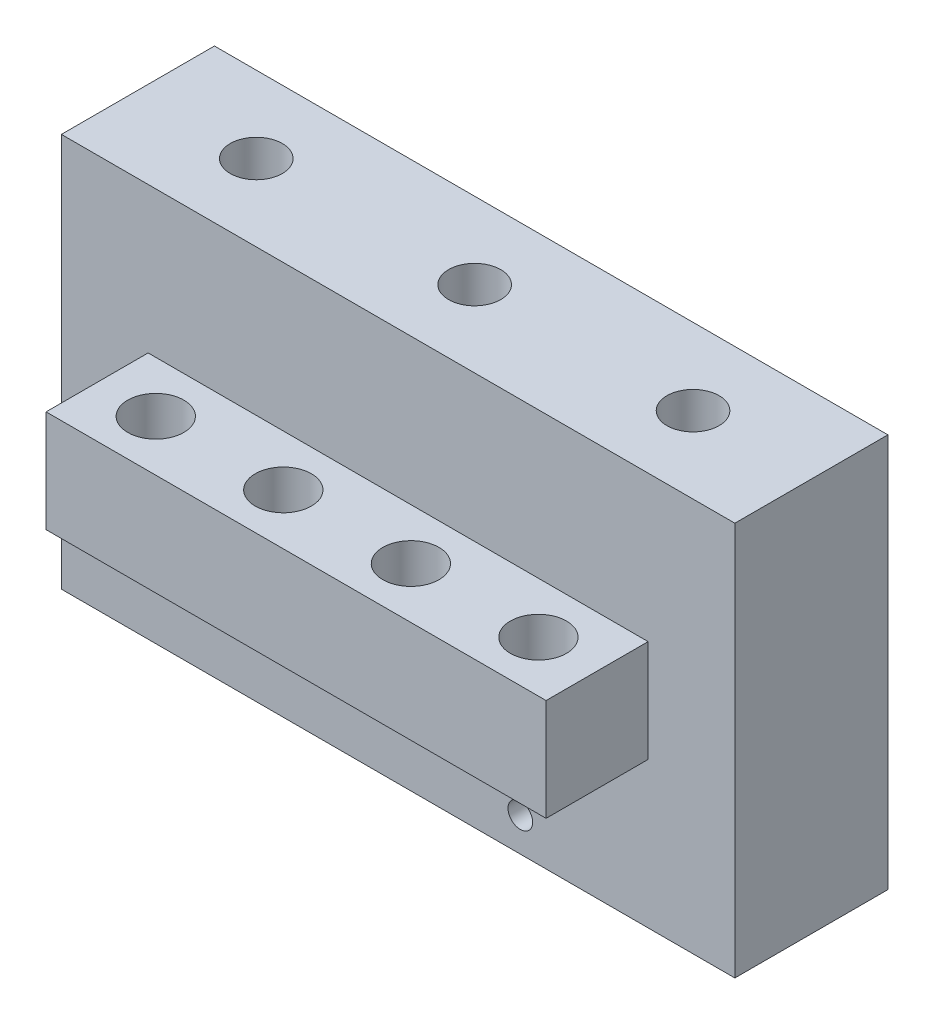
ISO-10303-21;
HEADER;
FILE_DESCRIPTION(('STEP AP214'),'2;1');
FILE_NAME('part.step','',(''),(''),'','','');
FILE_SCHEMA(('AUTOMOTIVE_DESIGN { 1 0 10303 214 1 1 1 1 }'));
ENDSEC;
DATA;
#1=APPLICATION_CONTEXT('core data for automotive mechanical design processes');
#2=APPLICATION_PROTOCOL_DEFINITION('international standard','automotive_design',2000,#1);
#3=PRODUCT_CONTEXT('',#1,'mechanical');
#4=PRODUCT('Part','Part','',(#3));
#5=PRODUCT_RELATED_PRODUCT_CATEGORY('part','',(#4));
#6=PRODUCT_DEFINITION_FORMATION('','',#4);
#7=PRODUCT_DEFINITION_CONTEXT('part definition',#1,'design');
#8=PRODUCT_DEFINITION('design','',#6,#7);
#9=PRODUCT_DEFINITION_SHAPE('','',#8);
#10=(LENGTH_UNIT() NAMED_UNIT(*) SI_UNIT(.MILLI.,.METRE.));
#11=(NAMED_UNIT(*) PLANE_ANGLE_UNIT() SI_UNIT($,.RADIAN.));
#12=(NAMED_UNIT(*) SI_UNIT($,.STERADIAN.) SOLID_ANGLE_UNIT());
#13=UNCERTAINTY_MEASURE_WITH_UNIT(LENGTH_MEASURE(1.E-05),#10,'distance_accuracy_value','');
#14=(GEOMETRIC_REPRESENTATION_CONTEXT(3) GLOBAL_UNCERTAINTY_ASSIGNED_CONTEXT((#13)) GLOBAL_UNIT_ASSIGNED_CONTEXT((#10,
#11,#12)) REPRESENTATION_CONTEXT('',''));
#15=CARTESIAN_POINT('',(0.,0.,0.));
#16=DIRECTION('',(0.,0.,1.));
#17=DIRECTION('',(1.,0.,0.));
#18=AXIS2_PLACEMENT_3D('',#15,#16,#17);
#19=CARTESIAN_POINT('',(24.5,10.,0.));
#20=DIRECTION('',(-1.,0.,0.));
#21=DIRECTION('',(0.,0.,1.));
#22=AXIS2_PLACEMENT_3D('',#19,#20,#21);
#23=PLANE('',#22);
#24=DIRECTION('',(0.,0.,-1.));
#25=VECTOR('',#24,1.);
#26=CARTESIAN_POINT('',(24.5,0.,0.));
#27=LINE('',#26,#25);
#28=CARTESIAN_POINT('',(24.5,0.,0.));
#29=VERTEX_POINT('',#28);
#30=CARTESIAN_POINT('',(24.5,0.,-10.));
#31=VERTEX_POINT('',#30);
#32=EDGE_CURVE('E157',#29,#31,#27,.T.);
#33=ORIENTED_EDGE('',*,*,#32,.T.);
#34=DIRECTION('',(0.,-1.,0.));
#35=VECTOR('',#34,1.);
#36=CARTESIAN_POINT('',(24.5,10.,-10.));
#37=LINE('',#36,#35);
#38=CARTESIAN_POINT('',(24.5,10.,-10.));
#39=VERTEX_POINT('',#38);
#40=EDGE_CURVE('E11',#39,#31,#37,.T.);
#41=ORIENTED_EDGE('',*,*,#40,.F.);
#42=DIRECTION('',(0.,0.,-1.));
#43=VECTOR('',#42,1.);
#44=CARTESIAN_POINT('',(24.5,10.,0.));
#45=LINE('',#44,#43);
#46=CARTESIAN_POINT('',(24.5,10.,0.));
#47=VERTEX_POINT('',#46);
#48=EDGE_CURVE('E76',#47,#39,#45,.T.);
#49=ORIENTED_EDGE('',*,*,#48,.F.);
#50=DIRECTION('',(0.,-1.,0.));
#51=VECTOR('',#50,1.);
#52=CARTESIAN_POINT('',(24.5,10.,0.));
#53=LINE('',#52,#51);
#54=EDGE_CURVE('E53',#47,#29,#53,.T.);
#55=ORIENTED_EDGE('',*,*,#54,.T.);
#56=EDGE_LOOP('',(#33,#41,#49,#55));
#57=FACE_BOUND('',#56,.T.);
#58=ADVANCED_FACE('F36',(#57),#23,.F.);
#59=CARTESIAN_POINT('',(-24.5,10.,0.));
#60=DIRECTION('',(-1.,0.,0.));
#61=DIRECTION('',(0.,0.,1.));
#62=AXIS2_PLACEMENT_3D('',#59,#60,#61);
#63=PLANE('',#62);
#64=DIRECTION('',(0.,0.,-1.));
#65=VECTOR('',#64,1.);
#66=CARTESIAN_POINT('',(-24.5,0.,0.));
#67=LINE('',#66,#65);
#68=CARTESIAN_POINT('',(-24.5,0.,0.));
#69=VERTEX_POINT('',#68);
#70=CARTESIAN_POINT('',(-24.5,0.,-10.));
#71=VERTEX_POINT('',#70);
#72=EDGE_CURVE('E191',#69,#71,#67,.T.);
#73=ORIENTED_EDGE('',*,*,#72,.F.);
#74=DIRECTION('',(0.,-1.,0.));
#75=VECTOR('',#74,1.);
#76=CARTESIAN_POINT('',(-24.5,10.,0.));
#77=LINE('',#76,#75);
#78=CARTESIAN_POINT('',(-24.5,10.,0.));
#79=VERTEX_POINT('',#78);
#80=EDGE_CURVE('E65',#79,#69,#77,.T.);
#81=ORIENTED_EDGE('',*,*,#80,.F.);
#82=DIRECTION('',(0.,0.,-1.));
#83=VECTOR('',#82,1.);
#84=CARTESIAN_POINT('',(-24.5,10.,0.));
#85=LINE('',#84,#83);
#86=CARTESIAN_POINT('',(-24.5,10.,-10.));
#87=VERTEX_POINT('',#86);
#88=EDGE_CURVE('E183',#79,#87,#85,.T.);
#89=ORIENTED_EDGE('',*,*,#88,.T.);
#90=DIRECTION('',(0.,-1.,0.));
#91=VECTOR('',#90,1.);
#92=CARTESIAN_POINT('',(-24.5,10.,-10.));
#93=LINE('',#92,#91);
#94=EDGE_CURVE('E45',#87,#71,#93,.T.);
#95=ORIENTED_EDGE('',*,*,#94,.T.);
#96=EDGE_LOOP('',(#73,#81,#89,#95));
#97=FACE_BOUND('',#96,.T.);
#98=ADVANCED_FACE('F200',(#97),#63,.T.);
#99=CARTESIAN_POINT('',(24.5,10.,0.));
#100=DIRECTION('',(0.,0.,1.));
#101=DIRECTION('',(1.,0.,0.));
#102=AXIS2_PLACEMENT_3D('',#99,#100,#101);
#103=PLANE('',#102);
#104=DIRECTION('',(-1.,0.,0.));
#105=VECTOR('',#104,1.);
#106=CARTESIAN_POINT('',(24.5,0.,0.));
#107=LINE('',#106,#105);
#108=EDGE_CURVE('E180',#29,#69,#107,.T.);
#109=ORIENTED_EDGE('',*,*,#108,.F.);
#110=ORIENTED_EDGE('',*,*,#54,.F.);
#111=DIRECTION('',(-1.,0.,0.));
#112=VECTOR('',#111,1.);
#113=CARTESIAN_POINT('',(24.5,10.,0.));
#114=LINE('',#113,#112);
#115=EDGE_CURVE('E186',#47,#79,#114,.T.);
#116=ORIENTED_EDGE('',*,*,#115,.T.);
#117=ORIENTED_EDGE('',*,*,#80,.T.);
#118=EDGE_LOOP('',(#109,#110,#116,#117));
#119=FACE_BOUND('',#118,.T.);
#120=ADVANCED_FACE('F208',(#119),#103,.T.);
#121=CARTESIAN_POINT('',(0.,10.,0.));
#122=DIRECTION('',(0.,-1.,0.));
#123=DIRECTION('',(0.,0.,-1.));
#124=AXIS2_PLACEMENT_3D('',#121,#122,#123);
#125=PLANE('',#124);
#126=CARTESIAN_POINT('',(-18.75,10.,-5.));
#127=DIRECTION('',(0.,1.,0.));
#128=DIRECTION('',(0.,0.,1.));
#129=AXIS2_PLACEMENT_3D('',#126,#127,#128);
#130=CIRCLE('',#129,2.75);
#131=CARTESIAN_POINT('',(-18.75,10.,-2.25));
#132=VERTEX_POINT('',#131);
#133=EDGE_CURVE('E158',#132,#132,#130,.T.);
#134=ORIENTED_EDGE('',*,*,#133,.F.);
#135=EDGE_LOOP('',(#134));
#136=FACE_BOUND('',#135,.T.);
#137=CARTESIAN_POINT('',(-6.25,10.,-5.));
#138=DIRECTION('',(0.,1.,0.));
#139=DIRECTION('',(0.,0.,1.));
#140=AXIS2_PLACEMENT_3D('',#137,#138,#139);
#141=CIRCLE('',#140,2.75);
#142=CARTESIAN_POINT('',(-6.25,10.,-2.25));
#143=VERTEX_POINT('',#142);
#144=EDGE_CURVE('E164',#143,#143,#141,.T.);
#145=ORIENTED_EDGE('',*,*,#144,.F.);
#146=EDGE_LOOP('',(#145));
#147=FACE_BOUND('',#146,.T.);
#148=CARTESIAN_POINT('',(6.25,10.,-5.));
#149=DIRECTION('',(0.,1.,0.));
#150=DIRECTION('',(0.,0.,1.));
#151=AXIS2_PLACEMENT_3D('',#148,#149,#150);
#152=CIRCLE('',#151,2.75);
#153=CARTESIAN_POINT('',(6.25,10.,-2.25));
#154=VERTEX_POINT('',#153);
#155=EDGE_CURVE('E170',#154,#154,#152,.T.);
#156=ORIENTED_EDGE('',*,*,#155,.F.);
#157=EDGE_LOOP('',(#156));
#158=FACE_BOUND('',#157,.T.);
#159=CARTESIAN_POINT('',(18.75,10.,-5.));
#160=DIRECTION('',(0.,1.,0.));
#161=DIRECTION('',(0.,0.,1.));
#162=AXIS2_PLACEMENT_3D('',#159,#160,#161);
#163=CIRCLE('',#162,2.75);
#164=CARTESIAN_POINT('',(18.75,10.,-2.25));
#165=VERTEX_POINT('',#164);
#166=EDGE_CURVE('E151',#165,#165,#163,.T.);
#167=ORIENTED_EDGE('',*,*,#166,.F.);
#168=EDGE_LOOP('',(#167));
#169=FACE_BOUND('',#168,.T.);
#170=ORIENTED_EDGE('',*,*,#48,.T.);
#171=DIRECTION('',(1.,0.,0.));
#172=VECTOR('',#171,1.);
#173=CARTESIAN_POINT('',(-24.5,10.,-10.));
#174=LINE('',#173,#172);
#175=EDGE_CURVE('E179',#87,#39,#174,.T.);
#176=ORIENTED_EDGE('',*,*,#175,.F.);
#177=ORIENTED_EDGE('',*,*,#88,.F.);
#178=ORIENTED_EDGE('',*,*,#115,.F.);
#179=EDGE_LOOP('',(#170,#176,#177,#178));
#180=FACE_BOUND('',#179,.T.);
#181=ADVANCED_FACE('F210',(#136,#147,#158,#169,#180),#125,.F.);
#182=CARTESIAN_POINT('',(0.,0.,0.));
#183=DIRECTION('',(0.,-1.,0.));
#184=DIRECTION('',(0.,0.,-1.));
#185=AXIS2_PLACEMENT_3D('',#182,#183,#184);
#186=PLANE('',#185);
#187=CARTESIAN_POINT('',(-18.75,0.,-5.));
#188=DIRECTION('',(0.,1.,0.));
#189=DIRECTION('',(0.,0.,1.));
#190=AXIS2_PLACEMENT_3D('',#187,#188,#189);
#191=CIRCLE('',#190,2.75);
#192=CARTESIAN_POINT('',(-18.75,0.,-2.25));
#193=VERTEX_POINT('',#192);
#194=EDGE_CURVE('E154',#193,#193,#191,.T.);
#195=ORIENTED_EDGE('',*,*,#194,.T.);
#196=EDGE_LOOP('',(#195));
#197=FACE_BOUND('',#196,.T.);
#198=CARTESIAN_POINT('',(-6.25,0.,-5.));
#199=DIRECTION('',(0.,1.,0.));
#200=DIRECTION('',(0.,0.,1.));
#201=AXIS2_PLACEMENT_3D('',#198,#199,#200);
#202=CIRCLE('',#201,2.75);
#203=CARTESIAN_POINT('',(-6.25,0.,-2.25));
#204=VERTEX_POINT('',#203);
#205=EDGE_CURVE('E161',#204,#204,#202,.T.);
#206=ORIENTED_EDGE('',*,*,#205,.T.);
#207=EDGE_LOOP('',(#206));
#208=FACE_BOUND('',#207,.T.);
#209=CARTESIAN_POINT('',(6.25,0.,-5.));
#210=DIRECTION('',(0.,1.,0.));
#211=DIRECTION('',(0.,0.,1.));
#212=AXIS2_PLACEMENT_3D('',#209,#210,#211);
#213=CIRCLE('',#212,2.75);
#214=CARTESIAN_POINT('',(6.25,0.,-2.25));
#215=VERTEX_POINT('',#214);
#216=EDGE_CURVE('E167',#215,#215,#213,.T.);
#217=ORIENTED_EDGE('',*,*,#216,.T.);
#218=EDGE_LOOP('',(#217));
#219=FACE_BOUND('',#218,.T.);
#220=CARTESIAN_POINT('',(18.75,0.,-5.));
#221=DIRECTION('',(0.,1.,0.));
#222=DIRECTION('',(0.,0.,1.));
#223=AXIS2_PLACEMENT_3D('',#220,#221,#222);
#224=CIRCLE('',#223,2.75);
#225=CARTESIAN_POINT('',(18.75,0.,-2.25));
#226=VERTEX_POINT('',#225);
#227=EDGE_CURVE('E173',#226,#226,#224,.T.);
#228=ORIENTED_EDGE('',*,*,#227,.T.);
#229=EDGE_LOOP('',(#228));
#230=FACE_BOUND('',#229,.T.);
#231=ORIENTED_EDGE('',*,*,#32,.F.);
#232=ORIENTED_EDGE('',*,*,#108,.T.);
#233=ORIENTED_EDGE('',*,*,#72,.T.);
#234=DIRECTION('',(1.,0.,0.));
#235=VECTOR('',#234,1.);
#236=CARTESIAN_POINT('',(-24.5,0.,-10.));
#237=LINE('',#236,#235);
#238=EDGE_CURVE('E189',#71,#31,#237,.T.);
#239=ORIENTED_EDGE('',*,*,#238,.T.);
#240=EDGE_LOOP('',(#231,#232,#233,#239));
#241=FACE_BOUND('',#240,.T.);
#242=ADVANCED_FACE('F205',(#197,#208,#219,#230,#241),#186,.T.);
#243=CARTESIAN_POINT('',(18.75,0.,-5.));
#244=DIRECTION('',(0.,1.,0.));
#245=DIRECTION('',(0.,0.,1.));
#246=AXIS2_PLACEMENT_3D('',#243,#244,#245);
#247=CYLINDRICAL_SURFACE('',#246,2.75);
#248=ORIENTED_EDGE('',*,*,#227,.F.);
#249=EDGE_LOOP('',(#248));
#250=FACE_BOUND('',#249,.T.);
#251=ORIENTED_EDGE('',*,*,#166,.T.);
#252=EDGE_LOOP('',(#251));
#253=FACE_BOUND('',#252,.T.);
#254=ADVANCED_FACE('F243',(#250,#253),#247,.F.);
#255=CARTESIAN_POINT('',(6.25,0.,-5.));
#256=DIRECTION('',(0.,1.,0.));
#257=DIRECTION('',(0.,0.,1.));
#258=AXIS2_PLACEMENT_3D('',#255,#256,#257);
#259=CYLINDRICAL_SURFACE('',#258,2.75);
#260=ORIENTED_EDGE('',*,*,#216,.F.);
#261=EDGE_LOOP('',(#260));
#262=FACE_BOUND('',#261,.T.);
#263=ORIENTED_EDGE('',*,*,#155,.T.);
#264=EDGE_LOOP('',(#263));
#265=FACE_BOUND('',#264,.T.);
#266=ADVANCED_FACE('F399',(#262,#265),#259,.F.);
#267=CARTESIAN_POINT('',(-6.25,0.,-5.));
#268=DIRECTION('',(0.,1.,0.));
#269=DIRECTION('',(0.,0.,1.));
#270=AXIS2_PLACEMENT_3D('',#267,#268,#269);
#271=CYLINDRICAL_SURFACE('',#270,2.75);
#272=ORIENTED_EDGE('',*,*,#205,.F.);
#273=EDGE_LOOP('',(#272));
#274=FACE_BOUND('',#273,.T.);
#275=ORIENTED_EDGE('',*,*,#144,.T.);
#276=EDGE_LOOP('',(#275));
#277=FACE_BOUND('',#276,.T.);
#278=ADVANCED_FACE('F395',(#274,#277),#271,.F.);
#279=CARTESIAN_POINT('',(-18.75,0.,-5.));
#280=DIRECTION('',(0.,1.,0.));
#281=DIRECTION('',(0.,0.,1.));
#282=AXIS2_PLACEMENT_3D('',#279,#280,#281);
#283=CYLINDRICAL_SURFACE('',#282,2.75);
#284=ORIENTED_EDGE('',*,*,#194,.F.);
#285=EDGE_LOOP('',(#284));
#286=FACE_BOUND('',#285,.T.);
#287=ORIENTED_EDGE('',*,*,#133,.T.);
#288=EDGE_LOOP('',(#287));
#289=FACE_BOUND('',#288,.T.);
#290=ADVANCED_FACE('F255',(#286,#289),#283,.F.);
#291=CARTESIAN_POINT('',(-33.,0.,-25.));
#292=DIRECTION('',(-1.,0.,0.));
#293=DIRECTION('',(0.,0.,1.));
#294=AXIS2_PLACEMENT_3D('',#291,#292,#293);
#295=PLANE('',#294);
#296=DIRECTION('',(0.,-1.,0.));
#297=VECTOR('',#296,1.);
#298=CARTESIAN_POINT('',(-33.,0.,-10.));
#299=LINE('',#298,#297);
#300=CARTESIAN_POINT('',(-33.,24.2999999988159,-10.));
#301=VERTEX_POINT('',#300);
#302=CARTESIAN_POINT('',(-33.,-14.3000000011841,-10.));
#303=VERTEX_POINT('',#302);
#304=EDGE_CURVE('E123',#301,#303,#299,.T.);
#305=ORIENTED_EDGE('',*,*,#304,.F.);
#306=DIRECTION('',(0.,0.,-1.));
#307=VECTOR('',#306,1.);
#308=CARTESIAN_POINT('',(-33.,24.2999999988159,56.349378294119));
#309=LINE('',#308,#307);
#310=CARTESIAN_POINT('',(-33.,24.2999999988159,-25.));
#311=VERTEX_POINT('',#310);
#312=EDGE_CURVE('E121',#301,#311,#309,.T.);
#313=ORIENTED_EDGE('',*,*,#312,.T.);
#314=DIRECTION('',(0.,-1.,0.));
#315=VECTOR('',#314,1.);
#316=CARTESIAN_POINT('',(-33.,0.,-25.));
#317=LINE('',#316,#315);
#318=CARTESIAN_POINT('',(-33.,-14.3000000011841,-25.));
#319=VERTEX_POINT('',#318);
#320=EDGE_CURVE('E107',#311,#319,#317,.T.);
#321=ORIENTED_EDGE('',*,*,#320,.T.);
#322=DIRECTION('',(0.,0.,-1.));
#323=VECTOR('',#322,1.);
#324=CARTESIAN_POINT('',(-33.,-14.3000000011841,56.349378294119));
#325=LINE('',#324,#323);
#326=EDGE_CURVE('E144',#303,#319,#325,.T.);
#327=ORIENTED_EDGE('',*,*,#326,.F.);
#328=EDGE_LOOP('',(#305,#313,#321,#327));
#329=FACE_BOUND('',#328,.T.);
#330=ADVANCED_FACE('F122',(#329),#295,.T.);
#331=CARTESIAN_POINT('',(33.,0.,-25.));
#332=DIRECTION('',(-1.,0.,0.));
#333=DIRECTION('',(0.,0.,1.));
#334=AXIS2_PLACEMENT_3D('',#331,#332,#333);
#335=PLANE('',#334);
#336=DIRECTION('',(0.,-1.,0.));
#337=VECTOR('',#336,1.);
#338=CARTESIAN_POINT('',(33.,0.,-10.));
#339=LINE('',#338,#337);
#340=CARTESIAN_POINT('',(33.,24.2999999988159,-10.));
#341=VERTEX_POINT('',#340);
#342=CARTESIAN_POINT('',(33.,-14.3000000011841,-10.));
#343=VERTEX_POINT('',#342);
#344=EDGE_CURVE('E118',#341,#343,#339,.T.);
#345=ORIENTED_EDGE('',*,*,#344,.T.);
#346=DIRECTION('',(0.,0.,-1.));
#347=VECTOR('',#346,1.);
#348=CARTESIAN_POINT('',(33.,-14.3000000011841,56.349378294119));
#349=LINE('',#348,#347);
#350=CARTESIAN_POINT('',(33.,-14.3000000011841,-25.));
#351=VERTEX_POINT('',#350);
#352=EDGE_CURVE('E146',#343,#351,#349,.T.);
#353=ORIENTED_EDGE('',*,*,#352,.T.);
#354=DIRECTION('',(0.,-1.,0.));
#355=VECTOR('',#354,1.);
#356=CARTESIAN_POINT('',(33.,0.,-25.));
#357=LINE('',#356,#355);
#358=CARTESIAN_POINT('',(33.,24.2999999988159,-25.));
#359=VERTEX_POINT('',#358);
#360=EDGE_CURVE('E117',#359,#351,#357,.T.);
#361=ORIENTED_EDGE('',*,*,#360,.F.);
#362=DIRECTION('',(0.,0.,-1.));
#363=VECTOR('',#362,1.);
#364=CARTESIAN_POINT('',(33.,24.2999999988159,56.349378294119));
#365=LINE('',#364,#363);
#366=EDGE_CURVE('E127',#341,#359,#365,.T.);
#367=ORIENTED_EDGE('',*,*,#366,.F.);
#368=EDGE_LOOP('',(#345,#353,#361,#367));
#369=FACE_BOUND('',#368,.T.);
#370=ADVANCED_FACE('F254',(#369),#335,.F.);
#371=CARTESIAN_POINT('',(0.,0.,-25.));
#372=DIRECTION('',(0.,0.,-1.));
#373=DIRECTION('',(-1.,0.,0.));
#374=AXIS2_PLACEMENT_3D('',#371,#372,#373);
#375=PLANE('',#374);
#376=CARTESIAN_POINT('',(11.9760999998328,-11.0000000010083,-25.));
#377=DIRECTION('',(0.,0.,-1.));
#378=DIRECTION('',(-1.,0.,0.));
#379=AXIS2_PLACEMENT_3D('',#376,#377,#378);
#380=ELLIPSE('',#379,1.2065,1.20586704213638);
#381=CARTESIAN_POINT('',(10.7695999998328,-11.0000000010083,-25.));
#382=VERTEX_POINT('',#381);
#383=EDGE_CURVE('E359',#382,#382,#380,.T.);
#384=ORIENTED_EDGE('',*,*,#383,.F.);
#385=EDGE_LOOP('',(#384));
#386=FACE_BOUND('',#385,.T.);
#387=ORIENTED_EDGE('',*,*,#360,.T.);
#388=DIRECTION('',(1.,0.,0.));
#389=VECTOR('',#388,1.);
#390=CARTESIAN_POINT('',(0.,-14.3000000011841,-25.));
#391=LINE('',#390,#389);
#392=EDGE_CURVE('E113',#319,#351,#391,.T.);
#393=ORIENTED_EDGE('',*,*,#392,.F.);
#394=ORIENTED_EDGE('',*,*,#320,.F.);
#395=DIRECTION('',(-1.,0.,0.));
#396=VECTOR('',#395,1.);
#397=CARTESIAN_POINT('',(0.,24.2999999988159,-25.));
#398=LINE('',#397,#396);
#399=EDGE_CURVE('E111',#359,#311,#398,.T.);
#400=ORIENTED_EDGE('',*,*,#399,.F.);
#401=EDGE_LOOP('',(#387,#393,#394,#400));
#402=FACE_BOUND('',#401,.T.);
#403=ADVANCED_FACE('F109',(#386,#402),#375,.T.);
#404=CARTESIAN_POINT('',(0.,0.,-10.));
#405=DIRECTION('',(0.,0.,-1.));
#406=DIRECTION('',(-1.,0.,0.));
#407=AXIS2_PLACEMENT_3D('',#404,#405,#406);
#408=PLANE('',#407);
#409=CARTESIAN_POINT('',(11.9760999998328,-11.0000000010083,-10.));
#410=DIRECTION('',(0.,0.,-1.));
#411=DIRECTION('',(-1.,0.,0.));
#412=AXIS2_PLACEMENT_3D('',#409,#410,#411);
#413=ELLIPSE('',#412,1.2065,1.20586704213638);
#414=CARTESIAN_POINT('',(10.7695999998328,-11.0000000010083,-10.));
#415=VERTEX_POINT('',#414);
#416=EDGE_CURVE('E39',#415,#415,#413,.T.);
#417=ORIENTED_EDGE('',*,*,#416,.T.);
#418=EDGE_LOOP('',(#417));
#419=FACE_BOUND('',#418,.T.);
#420=ORIENTED_EDGE('',*,*,#238,.F.);
#421=ORIENTED_EDGE('',*,*,#94,.F.);
#422=ORIENTED_EDGE('',*,*,#175,.T.);
#423=ORIENTED_EDGE('',*,*,#40,.T.);
#424=EDGE_LOOP('',(#420,#421,#422,#423));
#425=FACE_BOUND('',#424,.T.);
#426=ORIENTED_EDGE('',*,*,#304,.T.);
#427=DIRECTION('',(-1.,0.,0.));
#428=VECTOR('',#427,1.);
#429=CARTESIAN_POINT('',(0.,-14.3000000011841,-10.));
#430=LINE('',#429,#428);
#431=EDGE_CURVE('E141',#343,#303,#430,.T.);
#432=ORIENTED_EDGE('',*,*,#431,.F.);
#433=ORIENTED_EDGE('',*,*,#344,.F.);
#434=DIRECTION('',(1.,0.,0.));
#435=VECTOR('',#434,1.);
#436=CARTESIAN_POINT('',(0.,24.2999999988159,-10.));
#437=LINE('',#436,#435);
#438=EDGE_CURVE('E139',#301,#341,#437,.T.);
#439=ORIENTED_EDGE('',*,*,#438,.F.);
#440=EDGE_LOOP('',(#426,#432,#433,#439));
#441=FACE_BOUND('',#440,.T.);
#442=ADVANCED_FACE('F206',(#419,#425,#441),#408,.F.);
#443=CARTESIAN_POINT('',(0.,-14.3000000011841,56.349378294119));
#444=DIRECTION('',(0.,1.,0.));
#445=DIRECTION('',(-1.,0.,0.));
#446=AXIS2_PLACEMENT_3D('',#443,#444,#445);
#447=PLANE('',#446);
#448=CARTESIAN_POINT('',(-21.4,-14.3000000011841,-17.5));
#449=DIRECTION('',(0.,-1.,0.));
#450=DIRECTION('',(0.,0.,-1.));
#451=AXIS2_PLACEMENT_3D('',#448,#449,#450);
#452=CIRCLE('',#451,2.55269999999999);
#453=CARTESIAN_POINT('',(-21.4,-14.3000000011841,-20.0527));
#454=VERTEX_POINT('',#453);
#455=EDGE_CURVE('E361',#454,#454,#452,.T.);
#456=ORIENTED_EDGE('',*,*,#455,.F.);
#457=EDGE_LOOP('',(#456));
#458=FACE_BOUND('',#457,.T.);
#459=CARTESIAN_POINT('',(21.4,-14.3000000011841,-17.5));
#460=DIRECTION('',(0.,-1.,0.));
#461=DIRECTION('',(0.,0.,-1.));
#462=AXIS2_PLACEMENT_3D('',#459,#460,#461);
#463=CIRCLE('',#462,2.55269999999999);
#464=CARTESIAN_POINT('',(21.4,-14.3000000011841,-20.0527));
#465=VERTEX_POINT('',#464);
#466=EDGE_CURVE('E367',#465,#465,#463,.T.);
#467=ORIENTED_EDGE('',*,*,#466,.F.);
#468=EDGE_LOOP('',(#467));
#469=FACE_BOUND('',#468,.T.);
#470=CARTESIAN_POINT('',(0.,-14.3000000011841,-17.5));
#471=DIRECTION('',(0.,-1.,0.));
#472=DIRECTION('',(0.,0.,-1.));
#473=AXIS2_PLACEMENT_3D('',#470,#471,#472);
#474=CIRCLE('',#473,2.5527);
#475=CARTESIAN_POINT('',(0.,-14.3000000011841,-20.0527));
#476=VERTEX_POINT('',#475);
#477=EDGE_CURVE('E135',#476,#476,#474,.T.);
#478=ORIENTED_EDGE('',*,*,#477,.F.);
#479=EDGE_LOOP('',(#478));
#480=FACE_BOUND('',#479,.T.);
#481=ORIENTED_EDGE('',*,*,#352,.F.);
#482=ORIENTED_EDGE('',*,*,#431,.T.);
#483=ORIENTED_EDGE('',*,*,#326,.T.);
#484=ORIENTED_EDGE('',*,*,#392,.T.);
#485=EDGE_LOOP('',(#481,#482,#483,#484));
#486=FACE_BOUND('',#485,.T.);
#487=ADVANCED_FACE('F289',(#458,#469,#480,#486),#447,.F.);
#488=CARTESIAN_POINT('',(0.,24.2999999988159,56.349378294119));
#489=DIRECTION('',(0.,-1.,0.));
#490=DIRECTION('',(1.,0.,0.));
#491=AXIS2_PLACEMENT_3D('',#488,#489,#490);
#492=PLANE('',#491);
#493=CARTESIAN_POINT('',(-21.4,24.2999999988159,-17.5));
#494=DIRECTION('',(0.,-1.,0.));
#495=DIRECTION('',(0.,0.,-1.));
#496=AXIS2_PLACEMENT_3D('',#493,#494,#495);
#497=CIRCLE('',#496,2.55269999999999);
#498=CARTESIAN_POINT('',(-21.4,24.2999999988159,-20.0527));
#499=VERTEX_POINT('',#498);
#500=EDGE_CURVE('E364',#499,#499,#497,.T.);
#501=ORIENTED_EDGE('',*,*,#500,.T.);
#502=EDGE_LOOP('',(#501));
#503=FACE_BOUND('',#502,.T.);
#504=CARTESIAN_POINT('',(21.4,24.2999999988159,-17.5));
#505=DIRECTION('',(0.,-1.,0.));
#506=DIRECTION('',(0.,0.,-1.));
#507=AXIS2_PLACEMENT_3D('',#504,#505,#506);
#508=CIRCLE('',#507,2.55269999999999);
#509=CARTESIAN_POINT('',(21.4,24.2999999988159,-20.0527));
#510=VERTEX_POINT('',#509);
#511=EDGE_CURVE('E370',#510,#510,#508,.T.);
#512=ORIENTED_EDGE('',*,*,#511,.T.);
#513=EDGE_LOOP('',(#512));
#514=FACE_BOUND('',#513,.T.);
#515=CARTESIAN_POINT('',(0.,24.2999999988159,-17.5));
#516=DIRECTION('',(0.,-1.,0.));
#517=DIRECTION('',(0.,0.,-1.));
#518=AXIS2_PLACEMENT_3D('',#515,#516,#517);
#519=CIRCLE('',#518,2.55269999999999);
#520=CARTESIAN_POINT('',(0.,24.2999999988159,-20.0527));
#521=VERTEX_POINT('',#520);
#522=EDGE_CURVE('E132',#521,#521,#519,.T.);
#523=ORIENTED_EDGE('',*,*,#522,.T.);
#524=EDGE_LOOP('',(#523));
#525=FACE_BOUND('',#524,.T.);
#526=ORIENTED_EDGE('',*,*,#312,.F.);
#527=ORIENTED_EDGE('',*,*,#438,.T.);
#528=ORIENTED_EDGE('',*,*,#366,.T.);
#529=ORIENTED_EDGE('',*,*,#399,.T.);
#530=EDGE_LOOP('',(#526,#527,#528,#529));
#531=FACE_BOUND('',#530,.T.);
#532=ADVANCED_FACE('F130',(#503,#514,#525,#531),#492,.F.);
#533=CARTESIAN_POINT('',(0.,-14.3000000011841,-17.5));
#534=DIRECTION('',(0.,-1.,0.));
#535=DIRECTION('',(0.,0.,-1.));
#536=AXIS2_PLACEMENT_3D('',#533,#534,#535);
#537=CYLINDRICAL_SURFACE('',#536,2.55269999999999);
#538=ORIENTED_EDGE('',*,*,#522,.F.);
#539=EDGE_LOOP('',(#538));
#540=FACE_BOUND('',#539,.T.);
#541=ORIENTED_EDGE('',*,*,#477,.T.);
#542=EDGE_LOOP('',(#541));
#543=FACE_BOUND('',#542,.T.);
#544=ADVANCED_FACE('F274',(#540,#543),#537,.F.);
#545=CARTESIAN_POINT('',(21.4,-14.3000000011841,-17.5));
#546=DIRECTION('',(0.,-1.,0.));
#547=DIRECTION('',(0.,0.,-1.));
#548=AXIS2_PLACEMENT_3D('',#545,#546,#547);
#549=CYLINDRICAL_SURFACE('',#548,2.55269999999999);
#550=ORIENTED_EDGE('',*,*,#511,.F.);
#551=EDGE_LOOP('',(#550));
#552=FACE_BOUND('',#551,.T.);
#553=ORIENTED_EDGE('',*,*,#466,.T.);
#554=EDGE_LOOP('',(#553));
#555=FACE_BOUND('',#554,.T.);
#556=ADVANCED_FACE('F279',(#552,#555),#549,.F.);
#557=CARTESIAN_POINT('',(-21.4,-14.3000000011841,-17.5));
#558=DIRECTION('',(0.,-1.,0.));
#559=DIRECTION('',(0.,0.,-1.));
#560=AXIS2_PLACEMENT_3D('',#557,#558,#559);
#561=CYLINDRICAL_SURFACE('',#560,2.55269999999999);
#562=ORIENTED_EDGE('',*,*,#500,.F.);
#563=EDGE_LOOP('',(#562));
#564=FACE_BOUND('',#563,.T.);
#565=ORIENTED_EDGE('',*,*,#455,.T.);
#566=EDGE_LOOP('',(#565));
#567=FACE_BOUND('',#566,.T.);
#568=ADVANCED_FACE('F312',(#564,#567),#561,.F.);
#569=CARTESIAN_POINT('',(11.9760999998328,-11.0000000010083,0.));
#570=DIRECTION('',(0.,0.,-1.));
#571=DIRECTION('',(-1.,0.,0.));
#572=AXIS2_PLACEMENT_3D('',#569,#570,#571);
#573=ELLIPSE('',#572,1.2065,1.20586704213638);
#574=DIRECTION('',(0.,0.,-1.));
#575=VECTOR('',#574,1.);
#576=SURFACE_OF_LINEAR_EXTRUSION('',#573,#575);
#577=ORIENTED_EDGE('',*,*,#383,.T.);
#578=EDGE_LOOP('',(#577));
#579=FACE_BOUND('',#578,.T.);
#580=ORIENTED_EDGE('',*,*,#416,.F.);
#581=EDGE_LOOP('',(#580));
#582=FACE_BOUND('',#581,.T.);
#583=ADVANCED_FACE('F322',(#579,#582),#576,.F.);
#584=CLOSED_SHELL('',(#58,#98,#120,#181,#242,#254,#266,#278,#290,#330,#370,#403,#442,#487,#532,
#544,#556,#568,#583));
#585=MANIFOLD_SOLID_BREP('B2',#584);
#586=ADVANCED_BREP_SHAPE_REPRESENTATION('',(#18,#585),#14);
#587=SHAPE_DEFINITION_REPRESENTATION(#9,#586);
ENDSEC;
END-ISO-10303-21;
